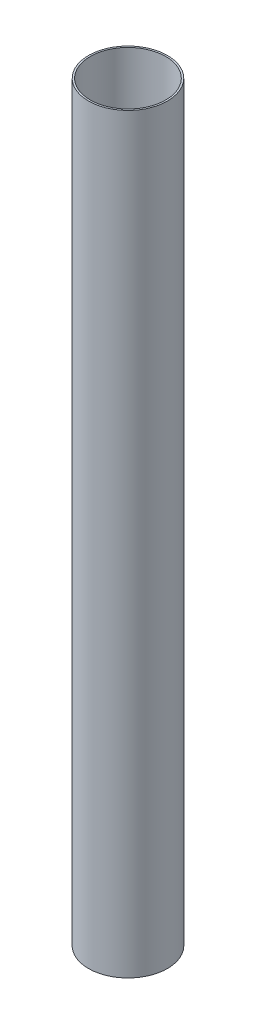
ISO-10303-21;
HEADER;
FILE_DESCRIPTION(('STEP AP214'),'2;1');
FILE_NAME('part.step','',(''),(''),'','','');
FILE_SCHEMA(('AUTOMOTIVE_DESIGN { 1 0 10303 214 1 1 1 1 }'));
ENDSEC;
DATA;
#1=APPLICATION_CONTEXT('core data for automotive mechanical design processes');
#2=APPLICATION_PROTOCOL_DEFINITION('international standard','automotive_design',2000,#1);
#3=PRODUCT_CONTEXT('',#1,'mechanical');
#4=PRODUCT('Part','Part','',(#3));
#5=PRODUCT_RELATED_PRODUCT_CATEGORY('part','',(#4));
#6=PRODUCT_DEFINITION_FORMATION('','',#4);
#7=PRODUCT_DEFINITION_CONTEXT('part definition',#1,'design');
#8=PRODUCT_DEFINITION('design','',#6,#7);
#9=PRODUCT_DEFINITION_SHAPE('','',#8);
#10=(LENGTH_UNIT() NAMED_UNIT(*) SI_UNIT(.MILLI.,.METRE.));
#11=(NAMED_UNIT(*) PLANE_ANGLE_UNIT() SI_UNIT($,.RADIAN.));
#12=(NAMED_UNIT(*) SI_UNIT($,.STERADIAN.) SOLID_ANGLE_UNIT());
#13=UNCERTAINTY_MEASURE_WITH_UNIT(LENGTH_MEASURE(1.E-05),#10,'distance_accuracy_value','');
#14=(GEOMETRIC_REPRESENTATION_CONTEXT(3) GLOBAL_UNCERTAINTY_ASSIGNED_CONTEXT((#13)) GLOBAL_UNIT_ASSIGNED_CONTEXT((#10,
#11,#12)) REPRESENTATION_CONTEXT('',''));
#15=CARTESIAN_POINT('',(0.,0.,0.));
#16=DIRECTION('',(0.,0.,1.));
#17=DIRECTION('',(1.,0.,0.));
#18=AXIS2_PLACEMENT_3D('',#15,#16,#17);
#19=CARTESIAN_POINT('',(476.510652388512,439.748427831157,242.672));
#20=DIRECTION('',(0.,1.,0.));
#21=DIRECTION('',(0.,0.,1.));
#22=AXIS2_PLACEMENT_3D('',#19,#20,#21);
#23=CYLINDRICAL_SURFACE('',#22,36.449);
#24=CARTESIAN_POINT('',(476.510652388512,-351.151572168843,242.672));
#25=DIRECTION('',(0.,1.,0.));
#26=DIRECTION('',(0.,0.,1.));
#27=AXIS2_PLACEMENT_3D('',#24,#25,#26);
#28=CIRCLE('',#27,36.449);
#29=CARTESIAN_POINT('',(476.510652388512,-351.151572168843,279.121));
#30=VERTEX_POINT('',#29);
#31=EDGE_CURVE('E31',#30,#30,#28,.F.);
#32=ORIENTED_EDGE('',*,*,#31,.T.);
#33=EDGE_LOOP('',(#32));
#34=FACE_BOUND('',#33,.T.);
#35=CARTESIAN_POINT('',(476.510652388512,374.160927831157,242.672));
#36=DIRECTION('',(0.,1.,0.));
#37=DIRECTION('',(0.,0.,1.));
#38=AXIS2_PLACEMENT_3D('',#35,#36,#37);
#39=CIRCLE('',#38,36.449);
#40=CARTESIAN_POINT('',(476.510652388512,374.160927831157,279.121));
#41=VERTEX_POINT('',#40);
#42=EDGE_CURVE('E17',#41,#41,#39,.T.);
#43=ORIENTED_EDGE('',*,*,#42,.T.);
#44=EDGE_LOOP('',(#43));
#45=FACE_BOUND('',#44,.T.);
#46=ADVANCED_FACE('F14',(#34,#45),#23,.F.);
#47=CARTESIAN_POINT('',(476.510652388512,374.160927831157,210.072));
#48=DIRECTION('',(0.,-1.,0.));
#49=DIRECTION('',(0.,0.,-1.));
#50=AXIS2_PLACEMENT_3D('',#47,#48,#49);
#51=PLANE('',#50);
#52=CARTESIAN_POINT('',(476.510652388512,374.160927831157,242.672));
#53=DIRECTION('',(0.,1.,0.));
#54=DIRECTION('',(0.,0.,1.));
#55=AXIS2_PLACEMENT_3D('',#52,#53,#54);
#56=CIRCLE('',#55,38.1);
#57=CARTESIAN_POINT('',(476.510652388512,374.160927831157,280.772));
#58=VERTEX_POINT('',#57);
#59=EDGE_CURVE('E22',#58,#58,#56,.F.);
#60=ORIENTED_EDGE('',*,*,#59,.F.);
#61=EDGE_LOOP('',(#60));
#62=FACE_BOUND('',#61,.T.);
#63=ORIENTED_EDGE('',*,*,#42,.F.);
#64=EDGE_LOOP('',(#63));
#65=FACE_BOUND('',#64,.T.);
#66=ADVANCED_FACE('F40',(#62,#65),#51,.F.);
#67=CARTESIAN_POINT('',(476.510652388512,-351.151572168843,276.625));
#68=DIRECTION('',(0.,1.,0.));
#69=DIRECTION('',(0.,0.,1.));
#70=AXIS2_PLACEMENT_3D('',#67,#68,#69);
#71=PLANE('',#70);
#72=CARTESIAN_POINT('',(476.510652388512,-351.151572168843,242.672));
#73=DIRECTION('',(0.,1.,0.));
#74=DIRECTION('',(0.,0.,1.));
#75=AXIS2_PLACEMENT_3D('',#72,#73,#74);
#76=CIRCLE('',#75,38.1);
#77=CARTESIAN_POINT('',(476.510652388512,-351.151572168843,280.772));
#78=VERTEX_POINT('',#77);
#79=EDGE_CURVE('E10',#78,#78,#76,.T.);
#80=ORIENTED_EDGE('',*,*,#79,.F.);
#81=EDGE_LOOP('',(#80));
#82=FACE_BOUND('',#81,.T.);
#83=ORIENTED_EDGE('',*,*,#31,.F.);
#84=EDGE_LOOP('',(#83));
#85=FACE_BOUND('',#84,.T.);
#86=ADVANCED_FACE('F42',(#82,#85),#71,.F.);
#87=CARTESIAN_POINT('',(476.510652388512,439.748427831157,242.672));
#88=DIRECTION('',(0.,1.,0.));
#89=DIRECTION('',(0.,0.,1.));
#90=AXIS2_PLACEMENT_3D('',#87,#88,#89);
#91=CYLINDRICAL_SURFACE('',#90,38.1);
#92=ORIENTED_EDGE('',*,*,#79,.T.);
#93=EDGE_LOOP('',(#92));
#94=FACE_BOUND('',#93,.T.);
#95=ORIENTED_EDGE('',*,*,#59,.T.);
#96=EDGE_LOOP('',(#95));
#97=FACE_BOUND('',#96,.T.);
#98=ADVANCED_FACE('F48',(#94,#97),#91,.T.);
#99=CLOSED_SHELL('',(#46,#66,#86,#98));
#100=MANIFOLD_SOLID_BREP('B1',#99);
#101=ADVANCED_BREP_SHAPE_REPRESENTATION('',(#18,#100),#14);
#102=SHAPE_DEFINITION_REPRESENTATION(#9,#101);
ENDSEC;
END-ISO-10303-21;
